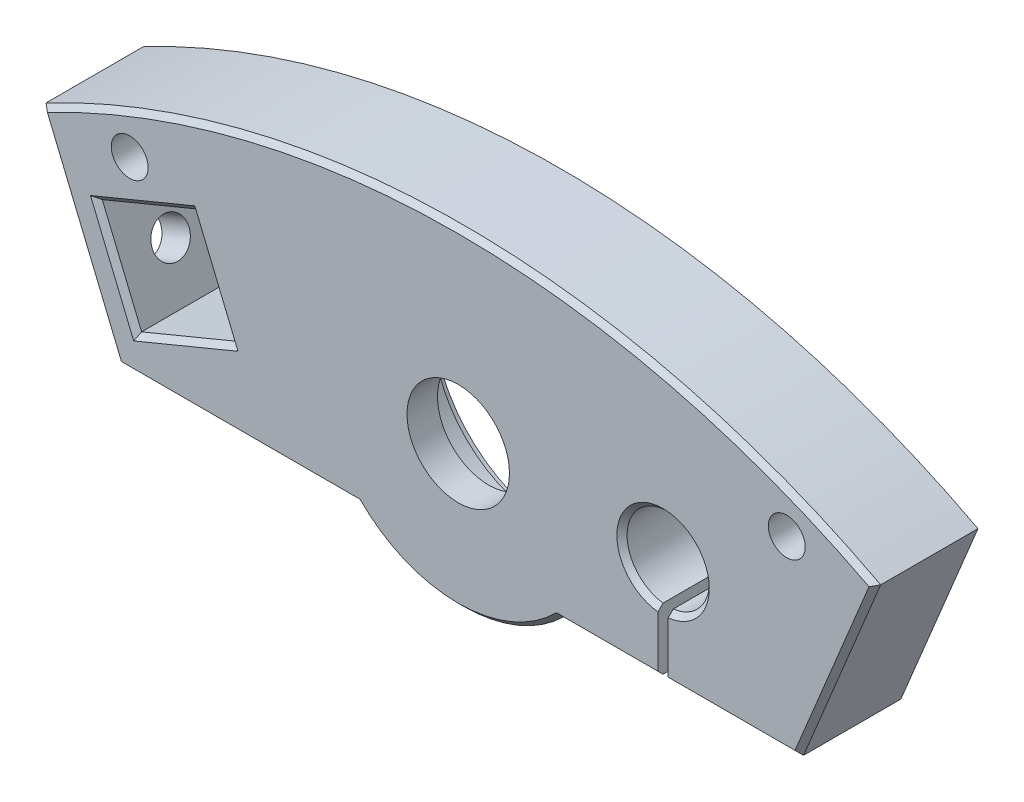
ISO-10303-21;
HEADER;
FILE_DESCRIPTION(('STEP AP214'),'2;1');
FILE_NAME('part.step','',(''),(''),'','','');
FILE_SCHEMA(('AUTOMOTIVE_DESIGN { 1 0 10303 214 1 1 1 1 }'));
ENDSEC;
DATA;
#1=APPLICATION_CONTEXT('core data for automotive mechanical design processes');
#2=APPLICATION_PROTOCOL_DEFINITION('international standard','automotive_design',2000,#1);
#3=PRODUCT_CONTEXT('',#1,'mechanical');
#4=PRODUCT('Part','Part','',(#3));
#5=PRODUCT_RELATED_PRODUCT_CATEGORY('part','',(#4));
#6=PRODUCT_DEFINITION_FORMATION('','',#4);
#7=PRODUCT_DEFINITION_CONTEXT('part definition',#1,'design');
#8=PRODUCT_DEFINITION('design','',#6,#7);
#9=PRODUCT_DEFINITION_SHAPE('','',#8);
#10=(LENGTH_UNIT() NAMED_UNIT(*) SI_UNIT(.MILLI.,.METRE.));
#11=(NAMED_UNIT(*) PLANE_ANGLE_UNIT() SI_UNIT($,.RADIAN.));
#12=(NAMED_UNIT(*) SI_UNIT($,.STERADIAN.) SOLID_ANGLE_UNIT());
#13=UNCERTAINTY_MEASURE_WITH_UNIT(LENGTH_MEASURE(1.E-05),#10,'distance_accuracy_value','');
#14=(GEOMETRIC_REPRESENTATION_CONTEXT(3) GLOBAL_UNCERTAINTY_ASSIGNED_CONTEXT((#13)) GLOBAL_UNIT_ASSIGNED_CONTEXT((#10,
#11,#12)) REPRESENTATION_CONTEXT('',''));
#15=CARTESIAN_POINT('',(0.,0.,0.));
#16=DIRECTION('',(0.,0.,1.));
#17=DIRECTION('',(1.,0.,0.));
#18=AXIS2_PLACEMENT_3D('',#15,#16,#17);
#19=CARTESIAN_POINT('',(0.,0.,7.025));
#20=DIRECTION('',(0.,0.,-1.));
#21=DIRECTION('',(-1.,0.,0.));
#22=AXIS2_PLACEMENT_3D('',#19,#20,#21);
#23=CYLINDRICAL_SURFACE('',#22,11.025);
#24=CARTESIAN_POINT('',(0.,0.,7.025));
#25=DIRECTION('',(0.,0.,-1.));
#26=DIRECTION('',(-1.,0.,0.));
#27=AXIS2_PLACEMENT_3D('',#24,#25,#26);
#28=CIRCLE('',#27,11.025);
#29=CARTESIAN_POINT('',(-11.025,0.,7.025));
#30=VERTEX_POINT('',#29);
#31=EDGE_CURVE('E293',#30,#30,#28,.T.);
#32=ORIENTED_EDGE('',*,*,#31,.F.);
#33=EDGE_LOOP('',(#32));
#34=FACE_BOUND('',#33,.T.);
#35=CARTESIAN_POINT('',(0.,0.,1.425));
#36=DIRECTION('',(0.,0.,-1.));
#37=DIRECTION('',(-1.,0.,0.));
#38=AXIS2_PLACEMENT_3D('',#35,#36,#37);
#39=CIRCLE('',#38,11.025);
#40=CARTESIAN_POINT('',(-11.025,0.,1.425));
#41=VERTEX_POINT('',#40);
#42=EDGE_CURVE('E294',#41,#41,#39,.F.);
#43=ORIENTED_EDGE('',*,*,#42,.F.);
#44=EDGE_LOOP('',(#43));
#45=FACE_BOUND('',#44,.T.);
#46=ADVANCED_FACE('F40',(#34,#45),#23,.F.);
#47=CARTESIAN_POINT('',(0.,0.,10.));
#48=DIRECTION('',(0.,0.,-1.));
#49=DIRECTION('',(-1.,0.,0.));
#50=AXIS2_PLACEMENT_3D('',#47,#48,#49);
#51=CYLINDRICAL_SURFACE('',#50,5.);
#52=CARTESIAN_POINT('',(0.,0.,10.));
#53=DIRECTION('',(0.,0.,1.));
#54=DIRECTION('',(1.,0.,0.));
#55=AXIS2_PLACEMENT_3D('',#52,#53,#54);
#56=CIRCLE('',#55,5.);
#57=CARTESIAN_POINT('',(5.,0.,10.));
#58=VERTEX_POINT('',#57);
#59=EDGE_CURVE('E201',#58,#58,#56,.T.);
#60=ORIENTED_EDGE('',*,*,#59,.T.);
#61=EDGE_LOOP('',(#60));
#62=FACE_BOUND('',#61,.T.);
#63=CARTESIAN_POINT('',(0.,0.,7.025));
#64=DIRECTION('',(0.,0.,-1.));
#65=DIRECTION('',(-1.,0.,0.));
#66=AXIS2_PLACEMENT_3D('',#63,#64,#65);
#67=CIRCLE('',#66,5.);
#68=CARTESIAN_POINT('',(-5.,0.,7.025));
#69=VERTEX_POINT('',#68);
#70=EDGE_CURVE('E289',#69,#69,#67,.T.);
#71=ORIENTED_EDGE('',*,*,#70,.T.);
#72=EDGE_LOOP('',(#71));
#73=FACE_BOUND('',#72,.T.);
#74=ADVANCED_FACE('F512',(#62,#73),#51,.F.);
#75=CARTESIAN_POINT('',(20.,0.,10.));
#76=DIRECTION('',(0.,0.,1.));
#77=DIRECTION('',(1.,0.,0.));
#78=AXIS2_PLACEMENT_3D('',#75,#76,#77);
#79=PLANE('',#78);
#80=DIRECTION('',(0.,-1.,0.));
#81=VECTOR('',#80,1.);
#82=CARTESIAN_POINT('',(20.5,-3.98122547088205,10.));
#83=LINE('',#82,#81);
#84=CARTESIAN_POINT('',(20.5,-4.48471361961944,10.));
#85=VERTEX_POINT('',#84);
#86=CARTESIAN_POINT('',(20.5,-9.49999999999999,10.));
#87=VERTEX_POINT('',#86);
#88=EDGE_CURVE('E236',#85,#87,#83,.T.);
#89=ORIENTED_EDGE('',*,*,#88,.T.);
#90=DIRECTION('',(1.,0.,0.));
#91=VECTOR('',#90,1.);
#92=CARTESIAN_POINT('',(33.2148210754482,-9.49999999999998,10.));
#93=LINE('',#92,#91);
#94=CARTESIAN_POINT('',(32.8807317564886,-9.49999999999998,10.));
#95=VERTEX_POINT('',#94);
#96=EDGE_CURVE('E381',#87,#95,#93,.T.);
#97=ORIENTED_EDGE('',*,*,#96,.T.);
#98=DIRECTION('',(0.382683432365087,0.923879532511288,0.));
#99=VECTOR('',#98,1.);
#100=CARTESIAN_POINT('',(40.2847592821813,8.37490366871128,10.));
#101=LINE('',#100,#99);
#102=CARTESIAN_POINT('',(40.1097463203878,7.95238500275836,10.));
#103=VERTEX_POINT('',#102);
#104=EDGE_CURVE('E379',#95,#103,#101,.T.);
#105=ORIENTED_EDGE('',*,*,#104,.T.);
#106=CARTESIAN_POINT('',(0.,-69.25,10.));
#107=DIRECTION('',(0.,0.,1.));
#108=DIRECTION('',(1.,0.,0.));
#109=AXIS2_PLACEMENT_3D('',#106,#107,#108);
#110=CIRCLE('',#109,87.);
#111=CARTESIAN_POINT('',(-40.1097463203878,7.95238500275837,10.));
#112=VERTEX_POINT('',#111);
#113=EDGE_CURVE('E357',#103,#112,#110,.T.);
#114=ORIENTED_EDGE('',*,*,#113,.T.);
#115=DIRECTION('',(0.382683432365087,-0.923879532511288,0.));
#116=VECTOR('',#115,1.);
#117=CARTESIAN_POINT('',(-32.7528813091926,-9.80865828381745,10.));
#118=LINE('',#117,#116);
#119=CARTESIAN_POINT('',(-32.8807317564886,-9.49999999999999,10.));
#120=VERTEX_POINT('',#119);
#121=EDGE_CURVE('E371',#112,#120,#118,.T.);
#122=ORIENTED_EDGE('',*,*,#121,.T.);
#123=DIRECTION('',(1.,0.,0.));
#124=VECTOR('',#123,1.);
#125=CARTESIAN_POINT('',(-9.79795897113272,-9.49999999999999,10.));
#126=LINE('',#125,#124);
#127=CARTESIAN_POINT('',(-9.59166304662543,-9.49999999999999,10.));
#128=VERTEX_POINT('',#127);
#129=EDGE_CURVE('E373',#120,#128,#126,.T.);
#130=ORIENTED_EDGE('',*,*,#129,.T.);
#131=CARTESIAN_POINT('',(0.,0.,10.));
#132=DIRECTION('',(0.,0.,1.));
#133=DIRECTION('',(1.,0.,0.));
#134=AXIS2_PLACEMENT_3D('',#131,#132,#133);
#135=CIRCLE('',#134,13.5);
#136=CARTESIAN_POINT('',(9.59166304662543,-9.49999999999999,10.));
#137=VERTEX_POINT('',#136);
#138=EDGE_CURVE('E375',#128,#137,#135,.T.);
#139=ORIENTED_EDGE('',*,*,#138,.T.);
#140=DIRECTION('',(1.,0.,0.));
#141=VECTOR('',#140,1.);
#142=CARTESIAN_POINT('',(19.5,-9.49999999999999,10.));
#143=LINE('',#142,#141);
#144=CARTESIAN_POINT('',(19.5,-9.49999999999999,10.));
#145=VERTEX_POINT('',#144);
#146=EDGE_CURVE('E377',#137,#145,#143,.T.);
#147=ORIENTED_EDGE('',*,*,#146,.T.);
#148=DIRECTION('',(0.,1.,0.));
#149=VECTOR('',#148,1.);
#150=CARTESIAN_POINT('',(19.5,-3.98122547088205,10.));
#151=LINE('',#150,#149);
#152=CARTESIAN_POINT('',(19.5,-4.48471361961944,10.));
#153=VERTEX_POINT('',#152);
#154=EDGE_CURVE('E234',#145,#153,#151,.T.);
#155=ORIENTED_EDGE('',*,*,#154,.T.);
#156=CARTESIAN_POINT('',(20.,0.,10.));
#157=DIRECTION('',(0.,0.,1.));
#158=DIRECTION('',(1.,0.,0.));
#159=AXIS2_PLACEMENT_3D('',#156,#157,#158);
#160=CIRCLE('',#159,4.51250000000001);
#161=EDGE_CURVE('E300',#153,#85,#160,.F.);
#162=ORIENTED_EDGE('',*,*,#161,.T.);
#163=EDGE_LOOP('',(#89,#97,#105,#114,#122,#130,#139,#147,#155,#162));
#164=FACE_BOUND('',#163,.T.);
#165=DIRECTION('',(-0.923879532511288,-0.382683432365087,0.));
#166=VECTOR('',#165,1.);
#167=CARTESIAN_POINT('',(14.9629251039806,12.1605745286592,10.));
#168=LINE('',#167,#166);
#169=CARTESIAN_POINT('',(-21.4988290835003,-2.94237856370927,10.));
#170=VERTEX_POINT('',#169);
#171=CARTESIAN_POINT('',(-31.6846009294372,-7.16146340553435,10.));
#172=VERTEX_POINT('',#171);
#173=EDGE_CURVE('E307',#170,#172,#168,.T.);
#174=ORIENTED_EDGE('',*,*,#173,.T.);
#175=DIRECTION('',(-0.382683432365087,0.923879532511288,0.));
#176=VECTOR('',#175,1.);
#177=CARTESIAN_POINT('',(-26.6475260334179,-19.3220379341935,10.));
#178=LINE('',#177,#176);
#179=CARTESIAN_POINT('',(-35.9036857712623,3.02430844040261,10.));
#180=VERTEX_POINT('',#179);
#181=EDGE_CURVE('E309',#172,#180,#178,.T.);
#182=ORIENTED_EDGE('',*,*,#181,.T.);
#183=DIRECTION('',(0.923879532511288,0.382683432365087,0.));
#184=VECTOR('',#183,1.);
#185=CARTESIAN_POINT('',(10.7438402621555,22.3463463745961,10.));
#186=LINE('',#185,#184);
#187=CARTESIAN_POINT('',(-25.7179139253254,7.24339328222769,10.));
#188=VERTEX_POINT('',#187);
#189=EDGE_CURVE('E303',#180,#188,#186,.T.);
#190=ORIENTED_EDGE('',*,*,#189,.T.);
#191=DIRECTION('',(0.382683432365087,-0.923879532511288,0.));
#192=VECTOR('',#191,1.);
#193=CARTESIAN_POINT('',(-16.4617541874809,-15.1029530923685,10.));
#194=LINE('',#193,#192);
#195=EDGE_CURVE('E305',#188,#170,#194,.T.);
#196=ORIENTED_EDGE('',*,*,#195,.T.);
#197=EDGE_LOOP('',(#174,#182,#190,#196));
#198=FACE_BOUND('',#197,.T.);
#199=CARTESIAN_POINT('',(-32.0764524899467,8.18940663404685,10.));
#200=DIRECTION('',(0.,0.,1.));
#201=DIRECTION('',(1.,0.,0.));
#202=AXIS2_PLACEMENT_3D('',#199,#200,#201);
#203=CIRCLE('',#202,1.8);
#204=CARTESIAN_POINT('',(-30.2764524899467,8.18940663404685,10.));
#205=VERTEX_POINT('',#204);
#206=EDGE_CURVE('E217',#205,#205,#203,.T.);
#207=ORIENTED_EDGE('',*,*,#206,.F.);
#208=EDGE_LOOP('',(#207));
#209=FACE_BOUND('',#208,.T.);
#210=ORIENTED_EDGE('',*,*,#59,.F.);
#211=EDGE_LOOP('',(#210));
#212=FACE_BOUND('',#211,.T.);
#213=CARTESIAN_POINT('',(32.0764524899467,8.18940663404685,10.));
#214=DIRECTION('',(0.,0.,1.));
#215=DIRECTION('',(-1.,0.,0.));
#216=AXIS2_PLACEMENT_3D('',#213,#214,#215);
#217=CIRCLE('',#216,1.8);
#218=CARTESIAN_POINT('',(30.2764524899467,8.18940663404685,10.));
#219=VERTEX_POINT('',#218);
#220=EDGE_CURVE('E563',#219,#219,#217,.T.);
#221=ORIENTED_EDGE('',*,*,#220,.F.);
#222=EDGE_LOOP('',(#221));
#223=FACE_BOUND('',#222,.T.);
#224=ADVANCED_FACE('F452',(#164,#198,#209,#212,#223),#79,.T.);
#225=CARTESIAN_POINT('',(20.,0.,0.));
#226=DIRECTION('',(0.,0.,1.));
#227=DIRECTION('',(1.,0.,0.));
#228=AXIS2_PLACEMENT_3D('',#225,#226,#227);
#229=PLANE('',#228);
#230=CARTESIAN_POINT('',(0.,0.,0.));
#231=DIRECTION('',(0.,0.,-1.));
#232=DIRECTION('',(-1.,0.,0.));
#233=AXIS2_PLACEMENT_3D('',#230,#231,#232);
#234=CIRCLE('',#233,12.525);
#235=CARTESIAN_POINT('',(-12.525,0.,0.));
#236=VERTEX_POINT('',#235);
#237=EDGE_CURVE('E369',#236,#236,#234,.T.);
#238=ORIENTED_EDGE('',*,*,#237,.F.);
#239=EDGE_LOOP('',(#238));
#240=FACE_BOUND('',#239,.T.);
#241=DIRECTION('',(0.382683432365087,0.923879532511288,0.));
#242=VECTOR('',#241,1.);
#243=CARTESIAN_POINT('',(40.746699048437,8.18356195252874,0.));
#244=LINE('',#243,#242);
#245=CARTESIAN_POINT('',(33.2148210754482,-9.99999999999999,0.));
#246=VERTEX_POINT('',#245);
#247=CARTESIAN_POINT('',(40.746699048437,8.18356195252873,0.));
#248=VERTEX_POINT('',#247);
#249=EDGE_CURVE('E233',#246,#248,#244,.T.);
#250=ORIENTED_EDGE('',*,*,#249,.F.);
#251=DIRECTION('',(1.,0.,0.));
#252=VECTOR('',#251,1.);
#253=CARTESIAN_POINT('',(33.2148210754482,-9.99999999999999,0.));
#254=LINE('',#253,#252);
#255=CARTESIAN_POINT('',(20.5,-10.,0.));
#256=VERTEX_POINT('',#255);
#257=EDGE_CURVE('E237',#256,#246,#254,.T.);
#258=ORIENTED_EDGE('',*,*,#257,.F.);
#259=DIRECTION('',(0.,-1.,0.));
#260=VECTOR('',#259,1.);
#261=CARTESIAN_POINT('',(20.5,-3.98122547088205,0.));
#262=LINE('',#261,#260);
#263=CARTESIAN_POINT('',(20.5,-3.98122547088205,0.));
#264=VERTEX_POINT('',#263);
#265=EDGE_CURVE('E264',#264,#256,#262,.T.);
#266=ORIENTED_EDGE('',*,*,#265,.F.);
#267=CARTESIAN_POINT('',(20.,0.,0.));
#268=DIRECTION('',(0.,0.,-1.));
#269=DIRECTION('',(1.,0.,0.));
#270=AXIS2_PLACEMENT_3D('',#267,#268,#269);
#271=CIRCLE('',#270,4.0125);
#272=CARTESIAN_POINT('',(19.5,-3.98122547088205,0.));
#273=VERTEX_POINT('',#272);
#274=EDGE_CURVE('E261',#273,#264,#271,.T.);
#275=ORIENTED_EDGE('',*,*,#274,.F.);
#276=DIRECTION('',(0.,1.,0.));
#277=VECTOR('',#276,1.);
#278=CARTESIAN_POINT('',(19.5,-3.98122547088205,0.));
#279=LINE('',#278,#277);
#280=CARTESIAN_POINT('',(19.5,-10.,0.));
#281=VERTEX_POINT('',#280);
#282=EDGE_CURVE('E258',#281,#273,#279,.T.);
#283=ORIENTED_EDGE('',*,*,#282,.F.);
#284=DIRECTION('',(1.,0.,0.));
#285=VECTOR('',#284,1.);
#286=CARTESIAN_POINT('',(19.5,-10.,0.));
#287=LINE('',#286,#285);
#288=CARTESIAN_POINT('',(9.79795897113271,-10.,0.));
#289=VERTEX_POINT('',#288);
#290=EDGE_CURVE('E255',#289,#281,#287,.T.);
#291=ORIENTED_EDGE('',*,*,#290,.F.);
#292=CARTESIAN_POINT('',(0.,0.,0.));
#293=DIRECTION('',(0.,0.,1.));
#294=DIRECTION('',(1.,0.,0.));
#295=AXIS2_PLACEMENT_3D('',#292,#293,#294);
#296=CIRCLE('',#295,14.);
#297=CARTESIAN_POINT('',(-9.79795897113272,-9.99999999999999,0.));
#298=VERTEX_POINT('',#297);
#299=EDGE_CURVE('E252',#298,#289,#296,.T.);
#300=ORIENTED_EDGE('',*,*,#299,.F.);
#301=DIRECTION('',(1.,0.,0.));
#302=VECTOR('',#301,1.);
#303=CARTESIAN_POINT('',(-33.2148210754482,-10.,0.));
#304=LINE('',#303,#302);
#305=CARTESIAN_POINT('',(-33.2148210754482,-10.,0.));
#306=VERTEX_POINT('',#305);
#307=EDGE_CURVE('E249',#306,#298,#304,.T.);
#308=ORIENTED_EDGE('',*,*,#307,.F.);
#309=DIRECTION('',(0.382683432365087,-0.923879532511288,0.));
#310=VECTOR('',#309,1.);
#311=CARTESIAN_POINT('',(-40.7466990484369,8.18356195252873,0.));
#312=LINE('',#311,#310);
#313=CARTESIAN_POINT('',(-40.7466990484369,8.18356195252873,0.));
#314=VERTEX_POINT('',#313);
#315=EDGE_CURVE('E246',#314,#306,#312,.T.);
#316=ORIENTED_EDGE('',*,*,#315,.F.);
#317=CARTESIAN_POINT('',(0.,-69.25,0.));
#318=DIRECTION('',(0.,0.,1.));
#319=DIRECTION('',(1.,0.,0.));
#320=AXIS2_PLACEMENT_3D('',#317,#318,#319);
#321=CIRCLE('',#320,87.5);
#322=EDGE_CURVE('E243',#248,#314,#321,.T.);
#323=ORIENTED_EDGE('',*,*,#322,.F.);
#324=EDGE_LOOP('',(#250,#258,#266,#275,#283,#291,#300,#308,#316,#323));
#325=FACE_BOUND('',#324,.T.);
#326=DIRECTION('',(-0.382683432365087,0.923879532511288,0.));
#327=VECTOR('',#326,1.);
#328=CARTESIAN_POINT('',(-22.1521105659385,-2.67178051363616,0.));
#329=LINE('',#328,#327);
#330=CARTESIAN_POINT('',(-22.1521105659385,-2.67178051363617,0.));
#331=VERTEX_POINT('',#330);
#332=CARTESIAN_POINT('',(-25.9885119753985,6.5901117997895,0.));
#333=VERTEX_POINT('',#332);
#334=EDGE_CURVE('E195',#331,#333,#329,.T.);
#335=ORIENTED_EDGE('',*,*,#334,.T.);
#336=DIRECTION('',(-0.923879532511288,-0.382683432365087,0.));
#337=VECTOR('',#336,1.);
#338=CARTESIAN_POINT('',(-25.9885119753985,6.5901117997895,0.));
#339=LINE('',#338,#337);
#340=CARTESIAN_POINT('',(-35.2504042888241,2.7537103903295,0.));
#341=VERTEX_POINT('',#340);
#342=EDGE_CURVE('E205',#333,#341,#339,.T.);
#343=ORIENTED_EDGE('',*,*,#342,.T.);
#344=DIRECTION('',(0.382683432365087,-0.923879532511288,0.));
#345=VECTOR('',#344,1.);
#346=CARTESIAN_POINT('',(-35.2504042888241,2.7537103903295,0.));
#347=LINE('',#346,#345);
#348=CARTESIAN_POINT('',(-31.4140028793641,-6.50818192309616,0.));
#349=VERTEX_POINT('',#348);
#350=EDGE_CURVE('E211',#341,#349,#347,.T.);
#351=ORIENTED_EDGE('',*,*,#350,.T.);
#352=DIRECTION('',(0.923879532511288,0.382683432365087,0.));
#353=VECTOR('',#352,1.);
#354=CARTESIAN_POINT('',(-31.4140028793641,-6.50818192309616,0.));
#355=LINE('',#354,#353);
#356=EDGE_CURVE('E216',#349,#331,#355,.T.);
#357=ORIENTED_EDGE('',*,*,#356,.T.);
#358=EDGE_LOOP('',(#335,#343,#351,#357));
#359=FACE_BOUND('',#358,.T.);
#360=CARTESIAN_POINT('',(-32.0764524899467,8.18940663404685,0.));
#361=DIRECTION('',(0.,0.,1.));
#362=DIRECTION('',(1.,0.,0.));
#363=AXIS2_PLACEMENT_3D('',#360,#361,#362);
#364=CIRCLE('',#363,1.8);
#365=CARTESIAN_POINT('',(-30.2764524899467,8.18940663404685,0.));
#366=VERTEX_POINT('',#365);
#367=EDGE_CURVE('E220',#366,#366,#364,.T.);
#368=ORIENTED_EDGE('',*,*,#367,.T.);
#369=EDGE_LOOP('',(#368));
#370=FACE_BOUND('',#369,.T.);
#371=CARTESIAN_POINT('',(32.0764524899467,8.18940663404685,0.));
#372=DIRECTION('',(0.,0.,1.));
#373=DIRECTION('',(-1.,0.,0.));
#374=AXIS2_PLACEMENT_3D('',#371,#372,#373);
#375=CIRCLE('',#374,1.8);
#376=CARTESIAN_POINT('',(30.2764524899467,8.18940663404685,0.));
#377=VERTEX_POINT('',#376);
#378=EDGE_CURVE('E292',#377,#377,#375,.T.);
#379=ORIENTED_EDGE('',*,*,#378,.T.);
#380=EDGE_LOOP('',(#379));
#381=FACE_BOUND('',#380,.T.);
#382=ADVANCED_FACE('F213',(#240,#325,#359,#370,#381),#229,.F.);
#383=CARTESIAN_POINT('',(40.746699048437,8.18356195252874,10.));
#384=DIRECTION('',(-0.923879532511288,0.382683432365087,0.));
#385=DIRECTION('',(-0.382683432365087,-0.923879532511288,0.));
#386=AXIS2_PLACEMENT_3D('',#383,#384,#385);
#387=PLANE('',#386);
#388=DIRECTION('',(0.,0.,-1.));
#389=VECTOR('',#388,1.);
#390=CARTESIAN_POINT('',(40.746699048437,8.18356195252873,10.));
#391=LINE('',#390,#389);
#392=CARTESIAN_POINT('',(40.746699048437,8.18356195252873,9.49999999999998));
#393=VERTEX_POINT('',#392);
#394=EDGE_CURVE('E286',#393,#248,#391,.T.);
#395=ORIENTED_EDGE('',*,*,#394,.F.);
#396=DIRECTION('',(-0.382683432365087,-0.923879532511288,0.));
#397=VECTOR('',#396,1.);
#398=CARTESIAN_POINT('',(33.2148210754482,-9.99999999999999,9.49999999999998));
#399=LINE('',#398,#397);
#400=CARTESIAN_POINT('',(33.2148210754482,-9.99999999999999,9.49999999999998));
#401=VERTEX_POINT('',#400);
#402=EDGE_CURVE('E388',#393,#401,#399,.T.);
#403=ORIENTED_EDGE('',*,*,#402,.T.);
#404=DIRECTION('',(0.,0.,-1.));
#405=VECTOR('',#404,1.);
#406=CARTESIAN_POINT('',(33.2148210754482,-9.99999999999999,10.));
#407=LINE('',#406,#405);
#408=EDGE_CURVE('E240',#401,#246,#407,.T.);
#409=ORIENTED_EDGE('',*,*,#408,.T.);
#410=ORIENTED_EDGE('',*,*,#249,.T.);
#411=EDGE_LOOP('',(#395,#403,#409,#410));
#412=FACE_BOUND('',#411,.T.);
#413=ADVANCED_FACE('F493',(#412),#387,.F.);
#414=CARTESIAN_POINT('',(0.,-69.25,10.));
#415=DIRECTION('',(0.,0.,-1.));
#416=DIRECTION('',(-1.,0.,0.));
#417=AXIS2_PLACEMENT_3D('',#414,#415,#416);
#418=CYLINDRICAL_SURFACE('',#417,87.5);
#419=DIRECTION('',(0.,0.,-1.));
#420=VECTOR('',#419,1.);
#421=CARTESIAN_POINT('',(-40.7466990484369,8.18356195252873,10.));
#422=LINE('',#421,#420);
#423=CARTESIAN_POINT('',(-40.7466990484369,8.18356195252873,9.49999999999998));
#424=VERTEX_POINT('',#423);
#425=EDGE_CURVE('E284',#424,#314,#422,.T.);
#426=ORIENTED_EDGE('',*,*,#425,.F.);
#427=CARTESIAN_POINT('',(0.,-69.25,9.49999999999998));
#428=DIRECTION('',(0.,0.,1.));
#429=DIRECTION('',(1.,0.,0.));
#430=AXIS2_PLACEMENT_3D('',#427,#428,#429);
#431=CIRCLE('',#430,87.5);
#432=EDGE_CURVE('E11',#424,#393,#431,.F.);
#433=ORIENTED_EDGE('',*,*,#432,.T.);
#434=ORIENTED_EDGE('',*,*,#394,.T.);
#435=ORIENTED_EDGE('',*,*,#322,.T.);
#436=EDGE_LOOP('',(#426,#433,#434,#435));
#437=FACE_BOUND('',#436,.T.);
#438=ADVANCED_FACE('F500',(#437),#418,.T.);
#439=CARTESIAN_POINT('',(-40.7466990484369,8.18356195252873,10.));
#440=DIRECTION('',(0.923879532511288,0.382683432365087,0.));
#441=DIRECTION('',(-0.382683432365087,0.923879532511288,0.));
#442=AXIS2_PLACEMENT_3D('',#439,#440,#441);
#443=PLANE('',#442);
#444=CARTESIAN_POINT('',(-36.1028854730471,-3.02759576230986,4.75));
#445=DIRECTION('',(0.923879532511288,0.382683432365087,0.));
#446=DIRECTION('',(-0.382683432365087,0.923879532511288,0.));
#447=AXIS2_PLACEMENT_3D('',#444,#445,#446);
#448=CIRCLE('',#447,1.8);
#449=CARTESIAN_POINT('',(-36.7917156513042,-1.36461260378954,4.75));
#450=VERTEX_POINT('',#449);
#451=EDGE_CURVE('E361',#450,#450,#448,.T.);
#452=ORIENTED_EDGE('',*,*,#451,.T.);
#453=EDGE_LOOP('',(#452));
#454=FACE_BOUND('',#453,.T.);
#455=DIRECTION('',(0.,0.,-1.));
#456=VECTOR('',#455,1.);
#457=CARTESIAN_POINT('',(-33.2148210754482,-10.,10.));
#458=LINE('',#457,#456);
#459=CARTESIAN_POINT('',(-33.2148210754482,-10.,9.49999999999998));
#460=VERTEX_POINT('',#459);
#461=EDGE_CURVE('E282',#460,#306,#458,.T.);
#462=ORIENTED_EDGE('',*,*,#461,.F.);
#463=DIRECTION('',(-0.382683432365087,0.923879532511288,0.));
#464=VECTOR('',#463,1.);
#465=CARTESIAN_POINT('',(-40.7466990484369,8.18356195252873,9.49999999999998));
#466=LINE('',#465,#464);
#467=EDGE_CURVE('E55',#460,#424,#466,.T.);
#468=ORIENTED_EDGE('',*,*,#467,.T.);
#469=ORIENTED_EDGE('',*,*,#425,.T.);
#470=ORIENTED_EDGE('',*,*,#315,.T.);
#471=EDGE_LOOP('',(#462,#468,#469,#470));
#472=FACE_BOUND('',#471,.T.);
#473=ADVANCED_FACE('F501',(#454,#472),#443,.F.);
#474=CARTESIAN_POINT('',(-33.2148210754482,-10.,10.));
#475=DIRECTION('',(0.,1.,0.));
#476=DIRECTION('',(0.,0.,1.));
#477=AXIS2_PLACEMENT_3D('',#474,#475,#476);
#478=PLANE('',#477);
#479=DIRECTION('',(0.,0.,-1.));
#480=VECTOR('',#479,1.);
#481=CARTESIAN_POINT('',(-9.79795897113272,-9.99999999999999,10.));
#482=LINE('',#481,#480);
#483=CARTESIAN_POINT('',(-9.79795897113272,-9.99999999999999,9.49999999999998));
#484=VERTEX_POINT('',#483);
#485=EDGE_CURVE('E280',#484,#298,#482,.T.);
#486=ORIENTED_EDGE('',*,*,#485,.F.);
#487=DIRECTION('',(-1.,0.,0.));
#488=VECTOR('',#487,1.);
#489=CARTESIAN_POINT('',(-33.2148210754482,-10.,9.49999999999998));
#490=LINE('',#489,#488);
#491=EDGE_CURVE('E70',#484,#460,#490,.T.);
#492=ORIENTED_EDGE('',*,*,#491,.T.);
#493=ORIENTED_EDGE('',*,*,#461,.T.);
#494=ORIENTED_EDGE('',*,*,#307,.T.);
#495=EDGE_LOOP('',(#486,#492,#493,#494));
#496=FACE_BOUND('',#495,.T.);
#497=ADVANCED_FACE('F502',(#496),#478,.F.);
#498=CARTESIAN_POINT('',(0.,0.,10.));
#499=DIRECTION('',(0.,0.,-1.));
#500=DIRECTION('',(-1.,0.,0.));
#501=AXIS2_PLACEMENT_3D('',#498,#499,#500);
#502=CYLINDRICAL_SURFACE('',#501,14.);
#503=DIRECTION('',(0.,0.,-1.));
#504=VECTOR('',#503,1.);
#505=CARTESIAN_POINT('',(9.79795897113271,-10.,10.));
#506=LINE('',#505,#504);
#507=CARTESIAN_POINT('',(9.79795897113271,-10.,9.49999999999998));
#508=VERTEX_POINT('',#507);
#509=EDGE_CURVE('E278',#508,#289,#506,.T.);
#510=ORIENTED_EDGE('',*,*,#509,.F.);
#511=CARTESIAN_POINT('',(0.,0.,9.49999999999998));
#512=DIRECTION('',(0.,0.,1.));
#513=DIRECTION('',(1.,0.,0.));
#514=AXIS2_PLACEMENT_3D('',#511,#512,#513);
#515=CIRCLE('',#514,14.);
#516=EDGE_CURVE('E394',#508,#484,#515,.F.);
#517=ORIENTED_EDGE('',*,*,#516,.T.);
#518=ORIENTED_EDGE('',*,*,#485,.T.);
#519=ORIENTED_EDGE('',*,*,#299,.T.);
#520=EDGE_LOOP('',(#510,#517,#518,#519));
#521=FACE_BOUND('',#520,.T.);
#522=ADVANCED_FACE('F504',(#521),#502,.T.);
#523=CARTESIAN_POINT('',(19.5,-10.,10.));
#524=DIRECTION('',(0.,1.,0.));
#525=DIRECTION('',(-1.,0.,0.));
#526=AXIS2_PLACEMENT_3D('',#523,#524,#525);
#527=PLANE('',#526);
#528=DIRECTION('',(0.,0.,-1.));
#529=VECTOR('',#528,1.);
#530=CARTESIAN_POINT('',(19.5,-10.,10.));
#531=LINE('',#530,#529);
#532=CARTESIAN_POINT('',(19.5,-10.,9.49999999999998));
#533=VERTEX_POINT('',#532);
#534=EDGE_CURVE('E276',#533,#281,#531,.T.);
#535=ORIENTED_EDGE('',*,*,#534,.F.);
#536=DIRECTION('',(-1.,0.,0.));
#537=VECTOR('',#536,1.);
#538=CARTESIAN_POINT('',(9.79795897113271,-10.,9.49999999999998));
#539=LINE('',#538,#537);
#540=EDGE_CURVE('E392',#533,#508,#539,.T.);
#541=ORIENTED_EDGE('',*,*,#540,.T.);
#542=ORIENTED_EDGE('',*,*,#509,.T.);
#543=ORIENTED_EDGE('',*,*,#290,.T.);
#544=EDGE_LOOP('',(#535,#541,#542,#543));
#545=FACE_BOUND('',#544,.T.);
#546=ADVANCED_FACE('F347',(#545),#527,.F.);
#547=CARTESIAN_POINT('',(19.5,-3.98122547088205,10.));
#548=DIRECTION('',(-1.,0.,0.));
#549=DIRECTION('',(0.,-1.,0.));
#550=AXIS2_PLACEMENT_3D('',#547,#548,#549);
#551=PLANE('',#550);
#552=ORIENTED_EDGE('',*,*,#154,.F.);
#553=DIRECTION('',(0.,-0.707106781186543,-0.707106781186552));
#554=VECTOR('',#553,1.);
#555=CARTESIAN_POINT('',(19.5,-9.49999999999999,10.));
#556=LINE('',#555,#554);
#557=EDGE_CURVE('E390',#145,#533,#556,.T.);
#558=ORIENTED_EDGE('',*,*,#557,.T.);
#559=ORIENTED_EDGE('',*,*,#534,.T.);
#560=ORIENTED_EDGE('',*,*,#282,.T.);
#561=DIRECTION('',(0.,0.,-1.));
#562=VECTOR('',#561,1.);
#563=CARTESIAN_POINT('',(19.5,-3.98122547088205,10.));
#564=LINE('',#563,#562);
#565=CARTESIAN_POINT('',(19.5,-3.98122547088205,9.49999999999999));
#566=VERTEX_POINT('',#565);
#567=EDGE_CURVE('E274',#566,#273,#564,.T.);
#568=ORIENTED_EDGE('',*,*,#567,.F.);
#569=CARTESIAN_POINT('',(19.5,-3.98122547088205,9.49999999999999));
#570=CARTESIAN_POINT('',(19.5,-4.0651743779087,9.58329887947978));
#571=CARTESIAN_POINT('',(19.5,-4.14910617725381,9.66661498598937));
#572=CARTESIAN_POINT('',(19.5,-4.31693556016611,9.83328165265621));
#573=CARTESIAN_POINT('',(19.5,-4.40083314373346,9.91663221281329));
#574=CARTESIAN_POINT('',(19.5,-4.48471361961944,10.));
#575=B_SPLINE_CURVE_WITH_KNOTS('',3,(#569,#570,#571,#572,#573,#574),.UNSPECIFIED.,.F.,.F.,(4,2,
4),(0.,0.354788789150735,0.709577576547465),.UNSPECIFIED.);
#576=EDGE_CURVE('E350',#566,#153,#575,.T.);
#577=ORIENTED_EDGE('',*,*,#576,.T.);
#578=EDGE_LOOP('',(#552,#558,#559,#560,#568,#577));
#579=FACE_BOUND('',#578,.T.);
#580=ADVANCED_FACE('F342',(#579),#551,.F.);
#581=CARTESIAN_POINT('',(20.,0.,10.));
#582=DIRECTION('',(0.,0.,-1.));
#583=DIRECTION('',(-1.,0.,0.));
#584=AXIS2_PLACEMENT_3D('',#581,#582,#583);
#585=CYLINDRICAL_SURFACE('',#584,4.0125);
#586=DIRECTION('',(0.,0.,-1.));
#587=VECTOR('',#586,1.);
#588=CARTESIAN_POINT('',(20.5,-3.98122547088205,10.));
#589=LINE('',#588,#587);
#590=CARTESIAN_POINT('',(20.5,-3.98122547088205,9.49999999999999));
#591=VERTEX_POINT('',#590);
#592=EDGE_CURVE('E272',#591,#264,#589,.T.);
#593=ORIENTED_EDGE('',*,*,#592,.F.);
#594=CARTESIAN_POINT('',(20.,0.,9.49999999999999));
#595=DIRECTION('',(0.,0.,1.));
#596=DIRECTION('',(1.,0.,0.));
#597=AXIS2_PLACEMENT_3D('',#594,#595,#596);
#598=CIRCLE('',#597,4.0125);
#599=EDGE_CURVE('E325',#591,#566,#598,.T.);
#600=ORIENTED_EDGE('',*,*,#599,.T.);
#601=ORIENTED_EDGE('',*,*,#567,.T.);
#602=ORIENTED_EDGE('',*,*,#274,.T.);
#603=EDGE_LOOP('',(#593,#600,#601,#602));
#604=FACE_BOUND('',#603,.T.);
#605=ADVANCED_FACE('F337',(#604),#585,.F.);
#606=CARTESIAN_POINT('',(20.5,-3.98122547088205,10.));
#607=DIRECTION('',(1.,0.,0.));
#608=DIRECTION('',(0.,1.,0.));
#609=AXIS2_PLACEMENT_3D('',#606,#607,#608);
#610=PLANE('',#609);
#611=DIRECTION('',(0.,0.,-1.));
#612=VECTOR('',#611,1.);
#613=CARTESIAN_POINT('',(20.5,-10.,10.));
#614=LINE('',#613,#612);
#615=CARTESIAN_POINT('',(20.5,-10.,9.49999999999998));
#616=VERTEX_POINT('',#615);
#617=EDGE_CURVE('E270',#616,#256,#614,.T.);
#618=ORIENTED_EDGE('',*,*,#617,.F.);
#619=DIRECTION('',(0.,0.707106781186543,0.707106781186552));
#620=VECTOR('',#619,1.);
#621=CARTESIAN_POINT('',(20.5,-9.49999999999999,10.));
#622=LINE('',#621,#620);
#623=EDGE_CURVE('E386',#616,#87,#622,.T.);
#624=ORIENTED_EDGE('',*,*,#623,.T.);
#625=ORIENTED_EDGE('',*,*,#88,.F.);
#626=CARTESIAN_POINT('',(20.5,-4.48471361961944,10.));
#627=CARTESIAN_POINT('',(20.5,-4.40083314373346,9.91663221281329));
#628=CARTESIAN_POINT('',(20.5,-4.31693556016611,9.83328165265621));
#629=CARTESIAN_POINT('',(20.5,-4.14910617725381,9.66661498598937));
#630=CARTESIAN_POINT('',(20.5,-4.0651743779087,9.58329887947978));
#631=CARTESIAN_POINT('',(20.5,-3.98122547088205,9.49999999999999));
#632=B_SPLINE_CURVE_WITH_KNOTS('',3,(#626,#627,#628,#629,#630,#631),.UNSPECIFIED.,.F.,.F.,(4,2,
4),(0.,0.35478878739673,0.709577576547464),.UNSPECIFIED.);
#633=EDGE_CURVE('E317',#85,#591,#632,.T.);
#634=ORIENTED_EDGE('',*,*,#633,.T.);
#635=ORIENTED_EDGE('',*,*,#592,.T.);
#636=ORIENTED_EDGE('',*,*,#265,.T.);
#637=EDGE_LOOP('',(#618,#624,#625,#634,#635,#636));
#638=FACE_BOUND('',#637,.T.);
#639=ADVANCED_FACE('F331',(#638),#610,.F.);
#640=CARTESIAN_POINT('',(33.2148210754482,-9.99999999999999,10.));
#641=DIRECTION('',(0.,1.,0.));
#642=DIRECTION('',(-1.,0.,0.));
#643=AXIS2_PLACEMENT_3D('',#640,#641,#642);
#644=PLANE('',#643);
#645=ORIENTED_EDGE('',*,*,#408,.F.);
#646=DIRECTION('',(-1.,0.,0.));
#647=VECTOR('',#646,1.);
#648=CARTESIAN_POINT('',(20.5,-10.,9.49999999999998));
#649=LINE('',#648,#647);
#650=EDGE_CURVE('E384',#401,#616,#649,.T.);
#651=ORIENTED_EDGE('',*,*,#650,.T.);
#652=ORIENTED_EDGE('',*,*,#617,.T.);
#653=ORIENTED_EDGE('',*,*,#257,.T.);
#654=EDGE_LOOP('',(#645,#651,#652,#653));
#655=FACE_BOUND('',#654,.T.);
#656=ADVANCED_FACE('F336',(#655),#644,.F.);
#657=CARTESIAN_POINT('',(-22.1521105659385,-2.67178051363616,10.));
#658=DIRECTION('',(-0.923879532511288,-0.382683432365087,0.));
#659=DIRECTION('',(0.382683432365087,-0.923879532511288,0.));
#660=AXIS2_PLACEMENT_3D('',#657,#658,#659);
#661=PLANE('',#660);
#662=DIRECTION('',(0.,0.,-1.));
#663=VECTOR('',#662,1.);
#664=CARTESIAN_POINT('',(-22.1521105659385,-2.67178051363616,10.));
#665=LINE('',#664,#663);
#666=CARTESIAN_POINT('',(-22.1521105659385,-2.67178051363616,9.49999999999999));
#667=VERTEX_POINT('',#666);
#668=EDGE_CURVE('E226',#667,#331,#665,.T.);
#669=ORIENTED_EDGE('',*,*,#668,.F.);
#670=DIRECTION('',(-0.382683432365087,0.923879532511288,0.));
#671=VECTOR('',#670,1.);
#672=CARTESIAN_POINT('',(-22.1521105659385,-2.67178051363616,9.49999999999999));
#673=LINE('',#672,#671);
#674=CARTESIAN_POINT('',(-25.9885119753985,6.5901117997895,9.49999999999999));
#675=VERTEX_POINT('',#674);
#676=EDGE_CURVE('E198',#667,#675,#673,.T.);
#677=ORIENTED_EDGE('',*,*,#676,.T.);
#678=DIRECTION('',(0.,0.,-1.));
#679=VECTOR('',#678,1.);
#680=CARTESIAN_POINT('',(-25.9885119753985,6.5901117997895,10.));
#681=LINE('',#680,#679);
#682=EDGE_CURVE('E190',#675,#333,#681,.T.);
#683=ORIENTED_EDGE('',*,*,#682,.T.);
#684=ORIENTED_EDGE('',*,*,#334,.F.);
#685=EDGE_LOOP('',(#669,#677,#683,#684));
#686=FACE_BOUND('',#685,.T.);
#687=ADVANCED_FACE('F193',(#686),#661,.T.);
#688=CARTESIAN_POINT('',(-25.9885119753985,6.5901117997895,10.));
#689=DIRECTION('',(0.382683432365087,-0.923879532511288,0.));
#690=DIRECTION('',(0.923879532511288,0.382683432365087,0.));
#691=AXIS2_PLACEMENT_3D('',#688,#689,#690);
#692=PLANE('',#691);
#693=ORIENTED_EDGE('',*,*,#682,.F.);
#694=DIRECTION('',(-0.923879532511288,-0.382683432365087,0.));
#695=VECTOR('',#694,1.);
#696=CARTESIAN_POINT('',(-25.9885119753985,6.5901117997895,9.49999999999999));
#697=LINE('',#696,#695);
#698=CARTESIAN_POINT('',(-35.2504042888241,2.7537103903295,9.49999999999999));
#699=VERTEX_POINT('',#698);
#700=EDGE_CURVE('E315',#675,#699,#697,.T.);
#701=ORIENTED_EDGE('',*,*,#700,.T.);
#702=DIRECTION('',(0.,0.,-1.));
#703=VECTOR('',#702,1.);
#704=CARTESIAN_POINT('',(-35.2504042888241,2.7537103903295,10.));
#705=LINE('',#704,#703);
#706=EDGE_CURVE('E202',#699,#341,#705,.T.);
#707=ORIENTED_EDGE('',*,*,#706,.T.);
#708=ORIENTED_EDGE('',*,*,#342,.F.);
#709=EDGE_LOOP('',(#693,#701,#707,#708));
#710=FACE_BOUND('',#709,.T.);
#711=ADVANCED_FACE('F206',(#710),#692,.T.);
#712=CARTESIAN_POINT('',(-35.2504042888241,2.7537103903295,10.));
#713=DIRECTION('',(0.923879532511288,0.382683432365087,0.));
#714=DIRECTION('',(-0.382683432365087,0.923879532511288,0.));
#715=AXIS2_PLACEMENT_3D('',#712,#713,#714);
#716=PLANE('',#715);
#717=CARTESIAN_POINT('',(-33.3312468755132,-1.87954546521461,4.75));
#718=DIRECTION('',(0.923879532511288,0.382683432365087,0.));
#719=DIRECTION('',(-0.382683432365087,0.923879532511288,0.));
#720=AXIS2_PLACEMENT_3D('',#717,#718,#719);
#721=CIRCLE('',#720,1.8);
#722=CARTESIAN_POINT('',(-34.0200770537704,-0.21656230669429,4.75));
#723=VERTEX_POINT('',#722);
#724=EDGE_CURVE('E605',#723,#723,#721,.T.);
#725=ORIENTED_EDGE('',*,*,#724,.F.);
#726=EDGE_LOOP('',(#725));
#727=FACE_BOUND('',#726,.T.);
#728=ORIENTED_EDGE('',*,*,#706,.F.);
#729=DIRECTION('',(0.382683432365087,-0.923879532511288,0.));
#730=VECTOR('',#729,1.);
#731=CARTESIAN_POINT('',(-35.2504042888241,2.7537103903295,9.49999999999999));
#732=LINE('',#731,#730);
#733=CARTESIAN_POINT('',(-31.4140028793641,-6.50818192309616,9.49999999999999));
#734=VERTEX_POINT('',#733);
#735=EDGE_CURVE('E288',#699,#734,#732,.T.);
#736=ORIENTED_EDGE('',*,*,#735,.T.);
#737=DIRECTION('',(0.,0.,-1.));
#738=VECTOR('',#737,1.);
#739=CARTESIAN_POINT('',(-31.4140028793641,-6.50818192309616,10.));
#740=LINE('',#739,#738);
#741=EDGE_CURVE('E228',#734,#349,#740,.T.);
#742=ORIENTED_EDGE('',*,*,#741,.T.);
#743=ORIENTED_EDGE('',*,*,#350,.F.);
#744=EDGE_LOOP('',(#728,#736,#742,#743));
#745=FACE_BOUND('',#744,.T.);
#746=ADVANCED_FACE('F537',(#727,#745),#716,.T.);
#747=CARTESIAN_POINT('',(-31.4140028793641,-6.50818192309616,10.));
#748=DIRECTION('',(-0.382683432365087,0.923879532511288,0.));
#749=DIRECTION('',(-0.923879532511288,-0.382683432365087,0.));
#750=AXIS2_PLACEMENT_3D('',#747,#748,#749);
#751=PLANE('',#750);
#752=ORIENTED_EDGE('',*,*,#741,.F.);
#753=DIRECTION('',(0.923879532511288,0.382683432365087,0.));
#754=VECTOR('',#753,1.);
#755=CARTESIAN_POINT('',(-31.4140028793641,-6.50818192309616,9.49999999999999));
#756=LINE('',#755,#754);
#757=EDGE_CURVE('E312',#734,#667,#756,.T.);
#758=ORIENTED_EDGE('',*,*,#757,.T.);
#759=ORIENTED_EDGE('',*,*,#668,.T.);
#760=ORIENTED_EDGE('',*,*,#356,.F.);
#761=EDGE_LOOP('',(#752,#758,#759,#760));
#762=FACE_BOUND('',#761,.T.);
#763=ADVANCED_FACE('F533',(#762),#751,.T.);
#764=CARTESIAN_POINT('',(-32.0764524899467,8.18940663404685,10.));
#765=DIRECTION('',(0.,0.,-1.));
#766=DIRECTION('',(-1.,0.,0.));
#767=AXIS2_PLACEMENT_3D('',#764,#765,#766);
#768=CYLINDRICAL_SURFACE('',#767,1.8);
#769=ORIENTED_EDGE('',*,*,#206,.T.);
#770=EDGE_LOOP('',(#769));
#771=FACE_BOUND('',#770,.T.);
#772=ORIENTED_EDGE('',*,*,#367,.F.);
#773=EDGE_LOOP('',(#772));
#774=FACE_BOUND('',#773,.T.);
#775=ADVANCED_FACE('F529',(#771,#774),#768,.F.);
#776=CARTESIAN_POINT('',(32.0764524899467,8.18940663404685,10.));
#777=DIRECTION('',(0.,0.,-1.));
#778=DIRECTION('',(-1.,0.,0.));
#779=AXIS2_PLACEMENT_3D('',#776,#777,#778);
#780=CYLINDRICAL_SURFACE('',#779,1.8);
#781=ORIENTED_EDGE('',*,*,#220,.T.);
#782=EDGE_LOOP('',(#781));
#783=FACE_BOUND('',#782,.T.);
#784=ORIENTED_EDGE('',*,*,#378,.F.);
#785=EDGE_LOOP('',(#784));
#786=FACE_BOUND('',#785,.T.);
#787=ADVANCED_FACE('F526',(#783,#786),#780,.F.);
#788=CARTESIAN_POINT('',(0.,0.,7.025));
#789=DIRECTION('',(0.,0.,-1.));
#790=DIRECTION('',(-1.,0.,0.));
#791=AXIS2_PLACEMENT_3D('',#788,#789,#790);
#792=PLANE('',#791);
#793=ORIENTED_EDGE('',*,*,#70,.F.);
#794=EDGE_LOOP('',(#793));
#795=FACE_BOUND('',#794,.T.);
#796=ORIENTED_EDGE('',*,*,#31,.T.);
#797=EDGE_LOOP('',(#796));
#798=FACE_BOUND('',#797,.T.);
#799=ADVANCED_FACE('F524',(#795,#798),#792,.T.);
#800=CARTESIAN_POINT('',(0.,0.,1.425));
#801=DIRECTION('',(0.,0.,-1.));
#802=DIRECTION('',(-1.,0.,0.));
#803=AXIS2_PLACEMENT_3D('',#800,#801,#802);
#804=PLANE('',#803);
#805=CARTESIAN_POINT('',(0.,0.,1.425));
#806=DIRECTION('',(0.,0.,-1.));
#807=DIRECTION('',(-1.,0.,0.));
#808=AXIS2_PLACEMENT_3D('',#805,#806,#807);
#809=CIRCLE('',#808,12.525);
#810=CARTESIAN_POINT('',(-12.525,0.,1.425));
#811=VERTEX_POINT('',#810);
#812=EDGE_CURVE('E297',#811,#811,#809,.T.);
#813=ORIENTED_EDGE('',*,*,#812,.T.);
#814=EDGE_LOOP('',(#813));
#815=FACE_BOUND('',#814,.T.);
#816=ORIENTED_EDGE('',*,*,#42,.T.);
#817=EDGE_LOOP('',(#816));
#818=FACE_BOUND('',#817,.T.);
#819=ADVANCED_FACE('F577',(#815,#818),#804,.T.);
#820=CARTESIAN_POINT('',(0.,0.,1.425));
#821=DIRECTION('',(0.,0.,-1.));
#822=DIRECTION('',(-1.,0.,0.));
#823=AXIS2_PLACEMENT_3D('',#820,#821,#822);
#824=CYLINDRICAL_SURFACE('',#823,12.525);
#825=ORIENTED_EDGE('',*,*,#812,.F.);
#826=EDGE_LOOP('',(#825));
#827=FACE_BOUND('',#826,.T.);
#828=ORIENTED_EDGE('',*,*,#237,.T.);
#829=EDGE_LOOP('',(#828));
#830=FACE_BOUND('',#829,.T.);
#831=ADVANCED_FACE('F582',(#827,#830),#824,.F.);
#832=CARTESIAN_POINT('',(-22.1521105659385,-2.67178051363616,9.49999999999999));
#833=DIRECTION('',(0.653281482438194,0.270598050073099,-0.707106781186542));
#834=DIRECTION('',(-0.382683432365087,0.923879532511288,0.));
#835=AXIS2_PLACEMENT_3D('',#832,#833,#834);
#836=PLANE('',#835);
#837=DIRECTION('',(0.754344479484567,-0.312459714103789,0.577350269189629));
#838=VECTOR('',#837,1.);
#839=CARTESIAN_POINT('',(-26.518208473567,-0.863283545647598,6.15833333333334));
#840=LINE('',#839,#838);
#841=EDGE_CURVE('E363',#170,#667,#840,.F.);
#842=ORIENTED_EDGE('',*,*,#841,.F.);
#843=ORIENTED_EDGE('',*,*,#195,.F.);
#844=DIRECTION('',(0.31245971410378,0.75434447948457,0.577350269189629));
#845=VECTOR('',#844,1.);
#846=CARTESIAN_POINT('',(-27.797008943387,2.22401389216094,6.1583333333333));
#847=LINE('',#846,#845);
#848=EDGE_CURVE('E366',#675,#188,#847,.T.);
#849=ORIENTED_EDGE('',*,*,#848,.F.);
#850=ORIENTED_EDGE('',*,*,#676,.F.);
#851=EDGE_LOOP('',(#842,#843,#849,#850));
#852=FACE_BOUND('',#851,.T.);
#853=ADVANCED_FACE('F590',(#852),#836,.F.);
#854=CARTESIAN_POINT('',(-25.9885119753985,6.5901117997895,9.49999999999999));
#855=DIRECTION('',(-0.270598050073097,0.65328148243819,-0.707106781186546));
#856=DIRECTION('',(-0.923879532511288,-0.382683432365087,0.));
#857=AXIS2_PLACEMENT_3D('',#854,#855,#856);
#858=PLANE('',#857);
#859=ORIENTED_EDGE('',*,*,#848,.T.);
#860=ORIENTED_EDGE('',*,*,#189,.F.);
#861=DIRECTION('',(0.754344479484572,-0.312459714103782,-0.577350269189626));
#862=VECTOR('',#861,1.);
#863=CARTESIAN_POINT('',(-35.2504042888241,2.7537103903295,9.49999999999999));
#864=LINE('',#863,#862);
#865=EDGE_CURVE('E360',#699,#180,#864,.F.);
#866=ORIENTED_EDGE('',*,*,#865,.F.);
#867=ORIENTED_EDGE('',*,*,#700,.F.);
#868=EDGE_LOOP('',(#859,#860,#866,#867));
#869=FACE_BOUND('',#868,.T.);
#870=ADVANCED_FACE('F623',(#869),#858,.F.);
#871=CARTESIAN_POINT('',(-31.4140028793641,-6.50818192309616,9.49999999999999));
#872=DIRECTION('',(0.270598050073097,-0.653281482438189,-0.707106781186547));
#873=DIRECTION('',(0.923879532511288,0.382683432365087,0.));
#874=AXIS2_PLACEMENT_3D('',#871,#872,#873);
#875=PLANE('',#874);
#876=ORIENTED_EDGE('',*,*,#841,.T.);
#877=ORIENTED_EDGE('',*,*,#757,.F.);
#878=DIRECTION('',(-0.312459714103786,-0.75434447948457,0.577350269189625));
#879=VECTOR('',#878,1.);
#880=CARTESIAN_POINT('',(-29.6055059113756,-2.14208401546761,6.15833333333333));
#881=LINE('',#880,#879);
#882=EDGE_CURVE('E358',#172,#734,#881,.F.);
#883=ORIENTED_EDGE('',*,*,#882,.F.);
#884=ORIENTED_EDGE('',*,*,#173,.F.);
#885=EDGE_LOOP('',(#876,#877,#883,#884));
#886=FACE_BOUND('',#885,.T.);
#887=ADVANCED_FACE('F619',(#886),#875,.F.);
#888=CARTESIAN_POINT('',(-35.2504042888241,2.7537103903295,9.49999999999999));
#889=DIRECTION('',(-0.653281482438188,-0.270598050073096,-0.707106781186549));
#890=DIRECTION('',(0.382683432365087,-0.923879532511288,0.));
#891=AXIS2_PLACEMENT_3D('',#888,#889,#890);
#892=PLANE('',#891);
#893=ORIENTED_EDGE('',*,*,#865,.T.);
#894=ORIENTED_EDGE('',*,*,#181,.F.);
#895=ORIENTED_EDGE('',*,*,#882,.T.);
#896=ORIENTED_EDGE('',*,*,#735,.F.);
#897=EDGE_LOOP('',(#893,#894,#895,#896));
#898=FACE_BOUND('',#897,.T.);
#899=ADVANCED_FACE('F601',(#898),#892,.F.);
#900=CARTESIAN_POINT('',(20.,0.,10.));
#901=DIRECTION('',(0.,0.,1.));
#902=DIRECTION('',(1.,0.,0.));
#903=AXIS2_PLACEMENT_3D('',#900,#901,#902);
#904=CONICAL_SURFACE('',#903,4.51250000000001,0.785398163397447);
#905=ORIENTED_EDGE('',*,*,#576,.F.);
#906=ORIENTED_EDGE('',*,*,#599,.F.);
#907=ORIENTED_EDGE('',*,*,#633,.F.);
#908=ORIENTED_EDGE('',*,*,#161,.F.);
#909=EDGE_LOOP('',(#905,#906,#907,#908));
#910=FACE_BOUND('',#909,.T.);
#911=ADVANCED_FACE('F327',(#910),#904,.F.);
#912=CARTESIAN_POINT('',(-42.5700422006261,-5.70637978886548,4.75));
#913=DIRECTION('',(0.923879532511288,0.382683432365087,0.));
#914=DIRECTION('',(-0.382683432365087,0.923879532511288,0.));
#915=AXIS2_PLACEMENT_3D('',#912,#913,#914);
#916=CYLINDRICAL_SURFACE('',#915,1.8);
#917=ORIENTED_EDGE('',*,*,#724,.T.);
#918=EDGE_LOOP('',(#917));
#919=FACE_BOUND('',#918,.T.);
#920=ORIENTED_EDGE('',*,*,#451,.F.);
#921=EDGE_LOOP('',(#920));
#922=FACE_BOUND('',#921,.T.);
#923=ADVANCED_FACE('F594',(#919,#922),#916,.F.);
#924=CARTESIAN_POINT('',(20.,-9.49999999999999,10.));
#925=DIRECTION('',(0.,-0.707106781186552,0.707106781186543));
#926=DIRECTION('',(-1.,0.,0.));
#927=AXIS2_PLACEMENT_3D('',#924,#925,#926);
#928=PLANE('',#927);
#929=ORIENTED_EDGE('',*,*,#557,.F.);
#930=ORIENTED_EDGE('',*,*,#146,.F.);
#931=CARTESIAN_POINT('',(9.79795897113271,-10.,9.49999999999998));
#932=CARTESIAN_POINT('',(9.76391343022089,-9.91659712495642,9.58340287504356));
#933=CARTESIAN_POINT('',(9.7296993333684,-9.83322902231645,9.66677097768353));
#934=CARTESIAN_POINT('',(9.66093402522439,-9.6665623556446,9.83343764435538));
#935=CARTESIAN_POINT('',(9.62638281390778,-9.58326379161791,9.91673620838208));
#936=CARTESIAN_POINT('',(9.59166304662543,-9.49999999999999,10.));
#937=B_SPLINE_CURVE_WITH_KNOTS('',3,(#931,#932,#933,#934,#935,#936),.UNSPECIFIED.,.F.,.F.,(4,2,
4),(0.,0.36829304838822,0.736586124173503),.UNSPECIFIED.);
#938=EDGE_CURVE('E45',#508,#137,#937,.T.);
#939=ORIENTED_EDGE('',*,*,#938,.F.);
#940=ORIENTED_EDGE('',*,*,#540,.F.);
#941=EDGE_LOOP('',(#929,#930,#939,#940));
#942=FACE_BOUND('',#941,.T.);
#943=ADVANCED_FACE('F42',(#942),#928,.T.);
#944=CARTESIAN_POINT('',(0.,0.,10.));
#945=DIRECTION('',(0.,0.,-1.));
#946=DIRECTION('',(-1.,0.,0.));
#947=AXIS2_PLACEMENT_3D('',#944,#945,#946);
#948=CONICAL_SURFACE('',#947,13.5,0.785398163397441);
#949=ORIENTED_EDGE('',*,*,#938,.T.);
#950=ORIENTED_EDGE('',*,*,#138,.F.);
#951=CARTESIAN_POINT('',(-9.79795897113272,-10.,9.49999999999998));
#952=CARTESIAN_POINT('',(-9.76391343022089,-9.91659712495642,9.58340287504356));
#953=CARTESIAN_POINT('',(-9.7296993333684,-9.83322902231645,9.66677097768353));
#954=CARTESIAN_POINT('',(-9.66093402522439,-9.66656235564461,9.83343764435538));
#955=CARTESIAN_POINT('',(-9.62638281390778,-9.58326379161791,9.91673620838208));
#956=CARTESIAN_POINT('',(-9.59166304662543,-9.49999999999998,10.));
#957=B_SPLINE_CURVE_WITH_KNOTS('',3,(#951,#952,#953,#954,#955,#956),.UNSPECIFIED.,.F.,.F.,(4,2,
4),(0.,0.368293048388219,0.736586124173504),.UNSPECIFIED.);
#958=EDGE_CURVE('E434',#484,#128,#957,.T.);
#959=ORIENTED_EDGE('',*,*,#958,.F.);
#960=ORIENTED_EDGE('',*,*,#516,.F.);
#961=EDGE_LOOP('',(#949,#950,#959,#960));
#962=FACE_BOUND('',#961,.T.);
#963=ADVANCED_FACE('F428',(#962),#948,.T.);
#964=CARTESIAN_POINT('',(20.,-9.49999999999999,10.));
#965=DIRECTION('',(0.,-0.707106781186552,0.707106781186543));
#966=DIRECTION('',(-1.,0.,0.));
#967=AXIS2_PLACEMENT_3D('',#964,#965,#966);
#968=PLANE('',#967);
#969=ORIENTED_EDGE('',*,*,#958,.T.);
#970=ORIENTED_EDGE('',*,*,#129,.F.);
#971=DIRECTION('',(0.427192174235137,0.639338269725911,0.63933826972592));
#972=VECTOR('',#971,1.);
#973=CARTESIAN_POINT('',(-34.9720529986596,-12.6298834226179,6.87011657738206));
#974=LINE('',#973,#972);
#975=EDGE_CURVE('E440',#460,#120,#974,.T.);
#976=ORIENTED_EDGE('',*,*,#975,.F.);
#977=ORIENTED_EDGE('',*,*,#491,.F.);
#978=EDGE_LOOP('',(#969,#970,#976,#977));
#979=FACE_BOUND('',#978,.T.);
#980=ADVANCED_FACE('F426',(#979),#968,.T.);
#981=CARTESIAN_POINT('',(-28.4952850984404,-20.0874047989237,10.));
#982=DIRECTION('',(-0.653281482438196,-0.270598050073099,0.70710678118654));
#983=DIRECTION('',(-0.382683432365087,0.923879532511288,0.));
#984=AXIS2_PLACEMENT_3D('',#981,#982,#983);
#985=PLANE('',#984);
#986=ORIENTED_EDGE('',*,*,#975,.T.);
#987=ORIENTED_EDGE('',*,*,#121,.F.);
#988=CARTESIAN_POINT('',(-40.7466990484369,8.18356195252873,9.49999999999998));
#989=CARTESIAN_POINT('',(-40.6405346275399,8.14518785251166,9.58339800323919));
#990=CARTESIAN_POINT('',(-40.5343730231421,8.10673605670889,9.66676367148252));
#991=CARTESIAN_POINT('',(-40.3220554471257,8.02967707345242,9.83343033814933));
#992=CARTESIAN_POINT('',(-40.2158994755072,7.99106988599841,9.91673133657267));
#993=CARTESIAN_POINT('',(-40.1097463203878,7.95238500275836,10.));
#994=B_SPLINE_CURVE_WITH_KNOTS('',3,(#988,#989,#990,#991,#992,#993),.UNSPECIFIED.,.F.,.F.,(4,2,
4),(0.,0.421055760456959,0.842111521782411),.UNSPECIFIED.);
#995=EDGE_CURVE('E409',#424,#112,#994,.T.);
#996=ORIENTED_EDGE('',*,*,#995,.F.);
#997=ORIENTED_EDGE('',*,*,#467,.F.);
#998=EDGE_LOOP('',(#986,#987,#996,#997));
#999=FACE_BOUND('',#998,.T.);
#1000=ADVANCED_FACE('F423',(#999),#985,.T.);
#1001=CARTESIAN_POINT('',(0.,-69.25,10.));
#1002=DIRECTION('',(0.,0.,-1.));
#1003=DIRECTION('',(-1.,0.,0.));
#1004=AXIS2_PLACEMENT_3D('',#1001,#1002,#1003);
#1005=CONICAL_SURFACE('',#1004,87.,0.785398163397455);
#1006=ORIENTED_EDGE('',*,*,#995,.T.);
#1007=ORIENTED_EDGE('',*,*,#113,.F.);
#1008=CARTESIAN_POINT('',(40.1097463203878,7.95238500275836,10.));
#1009=CARTESIAN_POINT('',(40.2158994755072,7.99106988599841,9.91673133657267));
#1010=CARTESIAN_POINT('',(40.3220554471257,8.02967707345242,9.83343033814933));
#1011=CARTESIAN_POINT('',(40.5343730231421,8.10673605670889,9.66676367148252));
#1012=CARTESIAN_POINT('',(40.64053462754,8.14518785251167,9.58339800323919));
#1013=CARTESIAN_POINT('',(40.746699048437,8.18356195252873,9.49999999999998));
#1014=B_SPLINE_CURVE_WITH_KNOTS('',3,(#1008,#1009,#1010,#1011,#1012,#1013),.UNSPECIFIED.,.F.,
.F.,(4,2,4),(0.,0.421055761325453,0.84211152178242),.UNSPECIFIED.);
#1015=EDGE_CURVE('E400',#393,#103,#1014,.F.);
#1016=ORIENTED_EDGE('',*,*,#1015,.F.);
#1017=ORIENTED_EDGE('',*,*,#432,.F.);
#1018=EDGE_LOOP('',(#1006,#1007,#1016,#1017));
#1019=FACE_BOUND('',#1018,.T.);
#1020=ADVANCED_FACE('F416',(#1019),#1005,.T.);
#1021=CARTESIAN_POINT('',(34.3531494747094,-5.94526917519284,10.));
#1022=DIRECTION('',(0.653281482438195,-0.270598050073099,0.707106781186541));
#1023=DIRECTION('',(-0.382683432365087,-0.923879532511288,0.));
#1024=AXIS2_PLACEMENT_3D('',#1021,#1022,#1023);
#1025=PLANE('',#1024);
#1026=ORIENTED_EDGE('',*,*,#1015,.T.);
#1027=ORIENTED_EDGE('',*,*,#104,.F.);
#1028=DIRECTION('',(0.427192174235138,-0.639338269725911,-0.63933826972592));
#1029=VECTOR('',#1028,1.);
#1030=CARTESIAN_POINT('',(32.178568740593,-8.44913878408012,11.0508612159199));
#1031=LINE('',#1030,#1029);
#1032=EDGE_CURVE('E398',#401,#95,#1031,.F.);
#1033=ORIENTED_EDGE('',*,*,#1032,.F.);
#1034=ORIENTED_EDGE('',*,*,#402,.F.);
#1035=EDGE_LOOP('',(#1026,#1027,#1033,#1034));
#1036=FACE_BOUND('',#1035,.T.);
#1037=ADVANCED_FACE('F418',(#1036),#1025,.T.);
#1038=CARTESIAN_POINT('',(20.,-9.49999999999999,10.));
#1039=DIRECTION('',(0.,-0.707106781186552,0.707106781186543));
#1040=DIRECTION('',(-1.,0.,0.));
#1041=AXIS2_PLACEMENT_3D('',#1038,#1039,#1040);
#1042=PLANE('',#1041);
#1043=ORIENTED_EDGE('',*,*,#623,.F.);
#1044=ORIENTED_EDGE('',*,*,#650,.F.);
#1045=ORIENTED_EDGE('',*,*,#1032,.T.);
#1046=ORIENTED_EDGE('',*,*,#96,.F.);
#1047=EDGE_LOOP('',(#1043,#1044,#1045,#1046));
#1048=FACE_BOUND('',#1047,.T.);
#1049=ADVANCED_FACE('F421',(#1048),#1042,.T.);
#1050=CLOSED_SHELL('',(#46,#74,#224,#382,#413,#438,#473,#497,#522,#546,#580,#605,#639,#656,#687,
#711,#746,#763,#775,#787,#799,#819,#831,#853,#870,#887,#899,#911,#923,#943,#963,#980,#1000,
#1020,#1037,#1049));
#1051=MANIFOLD_SOLID_BREP('B2',#1050);
#1052=ADVANCED_BREP_SHAPE_REPRESENTATION('',(#18,#1051),#14);
#1053=SHAPE_DEFINITION_REPRESENTATION(#9,#1052);
ENDSEC;
END-ISO-10303-21;
